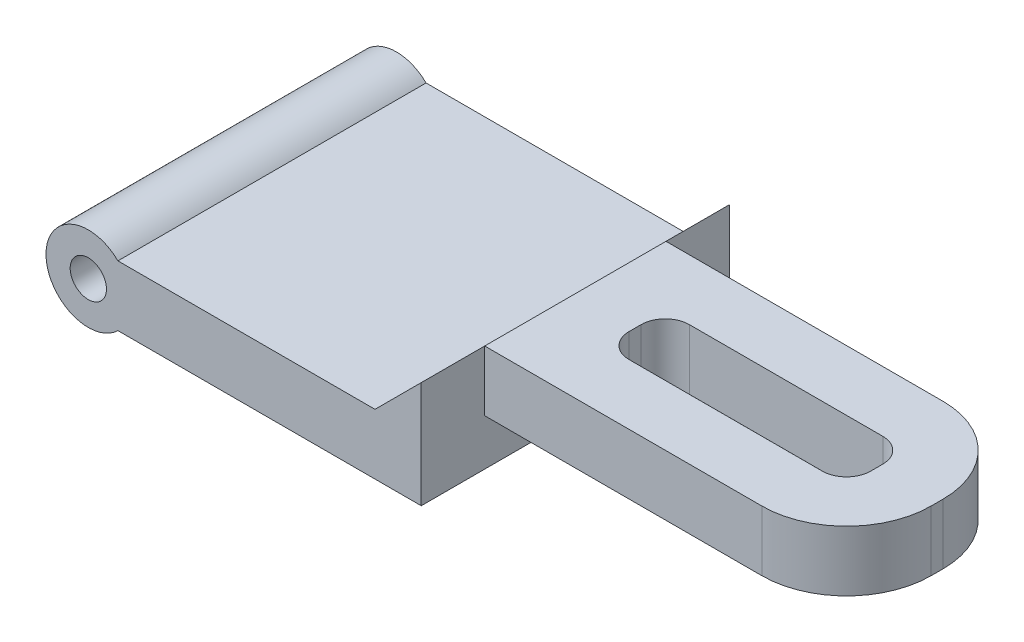
ISO-10303-21;
HEADER;
FILE_DESCRIPTION(('STEP AP214'),'2;1');
FILE_NAME('part.step','',(''),(''),'','','');
FILE_SCHEMA(('AUTOMOTIVE_DESIGN { 1 0 10303 214 1 1 1 1 }'));
ENDSEC;
DATA;
#1=APPLICATION_CONTEXT('core data for automotive mechanical design processes');
#2=APPLICATION_PROTOCOL_DEFINITION('international standard','automotive_design',2000,#1);
#3=PRODUCT_CONTEXT('',#1,'mechanical');
#4=PRODUCT('Part','Part','',(#3));
#5=PRODUCT_RELATED_PRODUCT_CATEGORY('part','',(#4));
#6=PRODUCT_DEFINITION_FORMATION('','',#4);
#7=PRODUCT_DEFINITION_CONTEXT('part definition',#1,'design');
#8=PRODUCT_DEFINITION('design','',#6,#7);
#9=PRODUCT_DEFINITION_SHAPE('','',#8);
#10=(LENGTH_UNIT() NAMED_UNIT(*) SI_UNIT(.MILLI.,.METRE.));
#11=(NAMED_UNIT(*) PLANE_ANGLE_UNIT() SI_UNIT($,.RADIAN.));
#12=(NAMED_UNIT(*) SI_UNIT($,.STERADIAN.) SOLID_ANGLE_UNIT());
#13=UNCERTAINTY_MEASURE_WITH_UNIT(LENGTH_MEASURE(1.E-05),#10,'distance_accuracy_value','');
#14=(GEOMETRIC_REPRESENTATION_CONTEXT(3) GLOBAL_UNCERTAINTY_ASSIGNED_CONTEXT((#13)) GLOBAL_UNIT_ASSIGNED_CONTEXT((#10,
#11,#12)) REPRESENTATION_CONTEXT('',''));
#15=CARTESIAN_POINT('',(0.,0.,0.));
#16=DIRECTION('',(0.,0.,1.));
#17=DIRECTION('',(1.,0.,0.));
#18=AXIS2_PLACEMENT_3D('',#15,#16,#17);
#19=CARTESIAN_POINT('',(0.,5.,0.));
#20=DIRECTION('',(0.,0.,-1.));
#21=DIRECTION('',(-1.,0.,0.));
#22=AXIS2_PLACEMENT_3D('',#19,#20,#21);
#23=PLANE('',#22);
#24=CARTESIAN_POINT('',(2.44948974278318,2.5,0.));
#25=DIRECTION('',(0.,0.,1.));
#26=DIRECTION('',(1.,0.,0.));
#27=AXIS2_PLACEMENT_3D('',#24,#25,#26);
#28=CIRCLE('',#27,1.5);
#29=CARTESIAN_POINT('',(3.94948974278318,2.5,0.));
#30=VERTEX_POINT('',#29);
#31=EDGE_CURVE('E246',#30,#30,#28,.T.);
#32=ORIENTED_EDGE('',*,*,#31,.F.);
#33=EDGE_LOOP('',(#32));
#34=FACE_BOUND('',#33,.T.);
#35=DIRECTION('',(0.,-1.,0.));
#36=VECTOR('',#35,1.);
#37=CARTESIAN_POINT('',(30.,5.,0.));
#38=LINE('',#37,#36);
#39=CARTESIAN_POINT('',(30.,8.82653248481806,0.));
#40=VERTEX_POINT('',#39);
#41=CARTESIAN_POINT('',(30.,0.,0.));
#42=VERTEX_POINT('',#41);
#43=EDGE_CURVE('E44',#40,#42,#38,.T.);
#44=ORIENTED_EDGE('',*,*,#43,.F.);
#45=DIRECTION('',(-0.707106781186547,-0.707106781186548,0.));
#46=VECTOR('',#45,1.);
#47=CARTESIAN_POINT('',(26.173467515182,5.,0.));
#48=LINE('',#47,#46);
#49=CARTESIAN_POINT('',(26.173467515182,5.,0.));
#50=VERTEX_POINT('',#49);
#51=EDGE_CURVE('E204',#40,#50,#48,.T.);
#52=ORIENTED_EDGE('',*,*,#51,.T.);
#53=DIRECTION('',(1.,0.,0.));
#54=VECTOR('',#53,1.);
#55=CARTESIAN_POINT('',(0.,5.,0.));
#56=LINE('',#55,#54);
#57=CARTESIAN_POINT('',(4.89897948556636,5.,0.));
#58=VERTEX_POINT('',#57);
#59=EDGE_CURVE('E210',#58,#50,#56,.T.);
#60=ORIENTED_EDGE('',*,*,#59,.F.);
#61=CARTESIAN_POINT('',(2.44948974278318,2.5,0.));
#62=DIRECTION('',(0.,0.,1.));
#63=DIRECTION('',(1.,0.,0.));
#64=AXIS2_PLACEMENT_3D('',#61,#62,#63);
#65=CIRCLE('',#64,3.5);
#66=CARTESIAN_POINT('',(4.89897948556636,0.,0.));
#67=VERTEX_POINT('',#66);
#68=EDGE_CURVE('E237',#58,#67,#65,.T.);
#69=ORIENTED_EDGE('',*,*,#68,.T.);
#70=DIRECTION('',(1.,0.,0.));
#71=VECTOR('',#70,1.);
#72=CARTESIAN_POINT('',(0.,0.,0.));
#73=LINE('',#72,#71);
#74=EDGE_CURVE('E211',#67,#42,#73,.T.);
#75=ORIENTED_EDGE('',*,*,#74,.T.);
#76=EDGE_LOOP('',(#44,#52,#60,#69,#75));
#77=FACE_BOUND('',#76,.T.);
#78=ADVANCED_FACE('F35',(#34,#77),#23,.F.);
#79=CARTESIAN_POINT('',(30.,5.,0.));
#80=DIRECTION('',(-1.,0.,0.));
#81=DIRECTION('',(0.,0.,1.));
#82=AXIS2_PLACEMENT_3D('',#79,#80,#81);
#83=PLANE('',#82);
#84=DIRECTION('',(0.,-1.,0.));
#85=VECTOR('',#84,1.);
#86=CARTESIAN_POINT('',(30.,5.,-25.5));
#87=LINE('',#86,#85);
#88=CARTESIAN_POINT('',(30.,8.82653248481806,-25.5));
#89=VERTEX_POINT('',#88);
#90=CARTESIAN_POINT('',(30.,0.,-25.5));
#91=VERTEX_POINT('',#90);
#92=EDGE_CURVE('E213',#89,#91,#87,.T.);
#93=ORIENTED_EDGE('',*,*,#92,.F.);
#94=DIRECTION('',(0.,0.,1.));
#95=VECTOR('',#94,1.);
#96=CARTESIAN_POINT('',(30.,8.82653248481806,-25.5));
#97=LINE('',#96,#95);
#98=CARTESIAN_POINT('',(30.,8.82653248481806,-20.25));
#99=VERTEX_POINT('',#98);
#100=EDGE_CURVE('E201',#89,#99,#97,.T.);
#101=ORIENTED_EDGE('',*,*,#100,.T.);
#102=DIRECTION('',(0.,-1.,0.));
#103=VECTOR('',#102,1.);
#104=CARTESIAN_POINT('',(30.,15.8298260225235,-20.25));
#105=LINE('',#104,#103);
#106=CARTESIAN_POINT('',(30.,3.82982602252354,-20.25));
#107=VERTEX_POINT('',#106);
#108=EDGE_CURVE('E195',#99,#107,#105,.T.);
#109=ORIENTED_EDGE('',*,*,#108,.T.);
#110=DIRECTION('',(0.,0.,1.));
#111=VECTOR('',#110,1.);
#112=CARTESIAN_POINT('',(30.,3.82982602252354,-25.5));
#113=LINE('',#112,#111);
#114=CARTESIAN_POINT('',(30.,3.82982602252354,-5.25));
#115=VERTEX_POINT('',#114);
#116=EDGE_CURVE('E188',#107,#115,#113,.T.);
#117=ORIENTED_EDGE('',*,*,#116,.T.);
#118=DIRECTION('',(0.,-1.,0.));
#119=VECTOR('',#118,1.);
#120=CARTESIAN_POINT('',(30.,15.8298260225235,-5.25));
#121=LINE('',#120,#119);
#122=CARTESIAN_POINT('',(30.,8.82653248481806,-5.25));
#123=VERTEX_POINT('',#122);
#124=EDGE_CURVE('E168',#123,#115,#121,.T.);
#125=ORIENTED_EDGE('',*,*,#124,.F.);
#126=DIRECTION('',(0.,0.,1.));
#127=VECTOR('',#126,1.);
#128=CARTESIAN_POINT('',(30.,8.82653248481806,-25.5));
#129=LINE('',#128,#127);
#130=EDGE_CURVE('E260',#123,#40,#129,.T.);
#131=ORIENTED_EDGE('',*,*,#130,.T.);
#132=ORIENTED_EDGE('',*,*,#43,.T.);
#133=DIRECTION('',(0.,0.,-1.));
#134=VECTOR('',#133,1.);
#135=CARTESIAN_POINT('',(30.,0.,0.));
#136=LINE('',#135,#134);
#137=EDGE_CURVE('E216',#42,#91,#136,.T.);
#138=ORIENTED_EDGE('',*,*,#137,.T.);
#139=EDGE_LOOP('',(#93,#101,#109,#117,#125,#131,#132,#138));
#140=FACE_BOUND('',#139,.T.);
#141=ADVANCED_FACE('F193',(#140),#83,.F.);
#142=CARTESIAN_POINT('',(0.,5.,-25.5));
#143=DIRECTION('',(0.,0.,-1.));
#144=DIRECTION('',(-1.,0.,0.));
#145=AXIS2_PLACEMENT_3D('',#142,#143,#144);
#146=PLANE('',#145);
#147=DIRECTION('',(-0.707106781186547,-0.707106781186548,0.));
#148=VECTOR('',#147,1.);
#149=CARTESIAN_POINT('',(26.173467515182,5.,-25.5));
#150=LINE('',#149,#148);
#151=CARTESIAN_POINT('',(26.173467515182,5.,-25.5));
#152=VERTEX_POINT('',#151);
#153=EDGE_CURVE('E198',#89,#152,#150,.T.);
#154=ORIENTED_EDGE('',*,*,#153,.F.);
#155=ORIENTED_EDGE('',*,*,#92,.T.);
#156=DIRECTION('',(1.,0.,0.));
#157=VECTOR('',#156,1.);
#158=CARTESIAN_POINT('',(0.,0.,-25.5));
#159=LINE('',#158,#157);
#160=CARTESIAN_POINT('',(4.89897948556636,0.,-25.5));
#161=VERTEX_POINT('',#160);
#162=EDGE_CURVE('E214',#161,#91,#159,.T.);
#163=ORIENTED_EDGE('',*,*,#162,.F.);
#164=CARTESIAN_POINT('',(2.44948974278318,2.5,-25.5));
#165=DIRECTION('',(0.,0.,1.));
#166=DIRECTION('',(1.,0.,0.));
#167=AXIS2_PLACEMENT_3D('',#164,#165,#166);
#168=CIRCLE('',#167,3.5);
#169=CARTESIAN_POINT('',(4.89897948556636,5.,-25.5));
#170=VERTEX_POINT('',#169);
#171=EDGE_CURVE('E239',#170,#161,#168,.T.);
#172=ORIENTED_EDGE('',*,*,#171,.F.);
#173=DIRECTION('',(1.,0.,0.));
#174=VECTOR('',#173,1.);
#175=CARTESIAN_POINT('',(0.,5.,-25.5));
#176=LINE('',#175,#174);
#177=EDGE_CURVE('E208',#170,#152,#176,.T.);
#178=ORIENTED_EDGE('',*,*,#177,.T.);
#179=EDGE_LOOP('',(#154,#155,#163,#172,#178));
#180=FACE_BOUND('',#179,.T.);
#181=CARTESIAN_POINT('',(2.44948974278318,2.5,-25.5));
#182=DIRECTION('',(0.,0.,-1.));
#183=DIRECTION('',(-1.,0.,0.));
#184=AXIS2_PLACEMENT_3D('',#181,#182,#183);
#185=CIRCLE('',#184,1.5);
#186=CARTESIAN_POINT('',(0.949489742783178,2.5,-25.5));
#187=VERTEX_POINT('',#186);
#188=EDGE_CURVE('E39',#187,#187,#185,.T.);
#189=ORIENTED_EDGE('',*,*,#188,.F.);
#190=EDGE_LOOP('',(#189));
#191=FACE_BOUND('',#190,.T.);
#192=ADVANCED_FACE('F37',(#180,#191),#146,.T.);
#193=CARTESIAN_POINT('',(0.,5.,0.));
#194=DIRECTION('',(0.,-1.,0.));
#195=DIRECTION('',(0.,0.,-1.));
#196=AXIS2_PLACEMENT_3D('',#193,#194,#195);
#197=PLANE('',#196);
#198=ORIENTED_EDGE('',*,*,#177,.F.);
#199=DIRECTION('',(0.,0.,1.));
#200=VECTOR('',#199,1.);
#201=CARTESIAN_POINT('',(4.89897948556636,5.,-25.5));
#202=LINE('',#201,#200);
#203=EDGE_CURVE('E240',#170,#58,#202,.T.);
#204=ORIENTED_EDGE('',*,*,#203,.T.);
#205=ORIENTED_EDGE('',*,*,#59,.T.);
#206=DIRECTION('',(0.,0.,1.));
#207=VECTOR('',#206,1.);
#208=CARTESIAN_POINT('',(26.173467515182,5.,-25.5));
#209=LINE('',#208,#207);
#210=EDGE_CURVE('E217',#152,#50,#209,.T.);
#211=ORIENTED_EDGE('',*,*,#210,.F.);
#212=EDGE_LOOP('',(#198,#204,#205,#211));
#213=FACE_BOUND('',#212,.T.);
#214=ADVANCED_FACE('F340',(#213),#197,.F.);
#215=CARTESIAN_POINT('',(0.,0.,0.));
#216=DIRECTION('',(0.,-1.,0.));
#217=DIRECTION('',(0.,0.,-1.));
#218=AXIS2_PLACEMENT_3D('',#215,#216,#217);
#219=PLANE('',#218);
#220=DIRECTION('',(0.,0.,1.));
#221=VECTOR('',#220,1.);
#222=CARTESIAN_POINT('',(4.89897948556636,0.,-25.5));
#223=LINE('',#222,#221);
#224=EDGE_CURVE('E11',#161,#67,#223,.T.);
#225=ORIENTED_EDGE('',*,*,#224,.F.);
#226=ORIENTED_EDGE('',*,*,#162,.T.);
#227=ORIENTED_EDGE('',*,*,#137,.F.);
#228=ORIENTED_EDGE('',*,*,#74,.F.);
#229=EDGE_LOOP('',(#225,#226,#227,#228));
#230=FACE_BOUND('',#229,.T.);
#231=ADVANCED_FACE('F234',(#230),#219,.T.);
#232=CARTESIAN_POINT('',(26.173467515182,5.,-25.5));
#233=DIRECTION('',(-0.707106781186548,0.707106781186547,0.));
#234=DIRECTION('',(-0.707106781186547,-0.707106781186548,0.));
#235=AXIS2_PLACEMENT_3D('',#232,#233,#234);
#236=PLANE('',#235);
#237=ORIENTED_EDGE('',*,*,#51,.F.);
#238=ORIENTED_EDGE('',*,*,#130,.F.);
#239=EDGE_CURVE('E197',#99,#123,#97,.T.);
#240=ORIENTED_EDGE('',*,*,#239,.F.);
#241=ORIENTED_EDGE('',*,*,#100,.F.);
#242=ORIENTED_EDGE('',*,*,#153,.T.);
#243=ORIENTED_EDGE('',*,*,#210,.T.);
#244=EDGE_LOOP('',(#237,#238,#240,#241,#242,#243));
#245=FACE_BOUND('',#244,.T.);
#246=ADVANCED_FACE('F270',(#245),#236,.T.);
#247=CARTESIAN_POINT('',(30.,8.82653248481806,-25.5));
#248=DIRECTION('',(0.,1.,0.));
#249=DIRECTION('',(-1.,0.,0.));
#250=AXIS2_PLACEMENT_3D('',#247,#248,#249);
#251=PLANE('',#250);
#252=DIRECTION('',(1.,0.,0.));
#253=VECTOR('',#252,1.);
#254=CARTESIAN_POINT('',(30.,8.82653248481806,-20.25));
#255=LINE('',#254,#253);
#256=CARTESIAN_POINT('',(52.9385656953439,8.82653248481806,-20.25));
#257=VERTEX_POINT('',#256);
#258=EDGE_CURVE('E258',#99,#257,#255,.T.);
#259=ORIENTED_EDGE('',*,*,#258,.F.);
#260=ORIENTED_EDGE('',*,*,#239,.T.);
#261=DIRECTION('',(-1.,0.,0.));
#262=VECTOR('',#261,1.);
#263=CARTESIAN_POINT('',(30.,8.82653248481806,-5.25));
#264=LINE('',#263,#262);
#265=CARTESIAN_POINT('',(52.9385656953439,8.82653248481806,-5.25));
#266=VERTEX_POINT('',#265);
#267=EDGE_CURVE('E175',#266,#123,#264,.T.);
#268=ORIENTED_EDGE('',*,*,#267,.F.);
#269=CARTESIAN_POINT('',(52.9385656953439,8.82653248481806,-12.25));
#270=DIRECTION('',(0.,1.,0.));
#271=DIRECTION('',(-1.,0.,0.));
#272=AXIS2_PLACEMENT_3D('',#269,#270,#271);
#273=CIRCLE('',#272,7.);
#274=CARTESIAN_POINT('',(59.9385656953439,8.82653248481806,-12.25));
#275=VERTEX_POINT('',#274);
#276=EDGE_CURVE('E272',#275,#266,#273,.F.);
#277=ORIENTED_EDGE('',*,*,#276,.F.);
#278=DIRECTION('',(0.,0.,1.));
#279=VECTOR('',#278,1.);
#280=CARTESIAN_POINT('',(59.9385656953439,8.82653248481806,-25.5));
#281=LINE('',#280,#279);
#282=CARTESIAN_POINT('',(59.9385656953439,8.82653248481806,-13.25));
#283=VERTEX_POINT('',#282);
#284=EDGE_CURVE('E277',#283,#275,#281,.T.);
#285=ORIENTED_EDGE('',*,*,#284,.F.);
#286=CARTESIAN_POINT('',(52.9385656953439,8.82653248481806,-13.25));
#287=DIRECTION('',(0.,1.,0.));
#288=DIRECTION('',(-1.,0.,0.));
#289=AXIS2_PLACEMENT_3D('',#286,#287,#288);
#290=CIRCLE('',#289,7.);
#291=EDGE_CURVE('E268',#257,#283,#290,.F.);
#292=ORIENTED_EDGE('',*,*,#291,.F.);
#293=EDGE_LOOP('',(#259,#260,#268,#277,#285,#292));
#294=FACE_BOUND('',#293,.T.);
#295=CARTESIAN_POINT('',(36.9385656953439,8.82653248481806,-13.25));
#296=DIRECTION('',(0.,1.,0.));
#297=DIRECTION('',(-1.,0.,0.));
#298=AXIS2_PLACEMENT_3D('',#295,#296,#297);
#299=CIRCLE('',#298,2.);
#300=CARTESIAN_POINT('',(36.9385656953439,8.82653248481806,-15.25));
#301=VERTEX_POINT('',#300);
#302=CARTESIAN_POINT('',(34.9385656953439,8.82653248481806,-13.25));
#303=VERTEX_POINT('',#302);
#304=EDGE_CURVE('E329',#301,#303,#299,.T.);
#305=ORIENTED_EDGE('',*,*,#304,.F.);
#306=DIRECTION('',(-1.,0.,0.));
#307=VECTOR('',#306,1.);
#308=CARTESIAN_POINT('',(30.,8.82653248481806,-15.25));
#309=LINE('',#308,#307);
#310=CARTESIAN_POINT('',(52.9385656953439,8.82653248481806,-15.25));
#311=VERTEX_POINT('',#310);
#312=EDGE_CURVE('E304',#311,#301,#309,.T.);
#313=ORIENTED_EDGE('',*,*,#312,.F.);
#314=CARTESIAN_POINT('',(52.9385656953439,8.82653248481806,-13.25));
#315=DIRECTION('',(0.,1.,0.));
#316=DIRECTION('',(-1.,0.,0.));
#317=AXIS2_PLACEMENT_3D('',#314,#315,#316);
#318=CIRCLE('',#317,2.);
#319=CARTESIAN_POINT('',(54.9385656953439,8.82653248481806,-13.25));
#320=VERTEX_POINT('',#319);
#321=EDGE_CURVE('E318',#320,#311,#318,.T.);
#322=ORIENTED_EDGE('',*,*,#321,.F.);
#323=DIRECTION('',(0.,0.,-1.));
#324=VECTOR('',#323,1.);
#325=CARTESIAN_POINT('',(54.9385656953439,8.82653248481806,-25.5));
#326=LINE('',#325,#324);
#327=CARTESIAN_POINT('',(54.9385656953439,8.82653248481806,-12.25));
#328=VERTEX_POINT('',#327);
#329=EDGE_CURVE('E320',#328,#320,#326,.T.);
#330=ORIENTED_EDGE('',*,*,#329,.F.);
#331=CARTESIAN_POINT('',(52.9385656953439,8.82653248481806,-12.25));
#332=DIRECTION('',(0.,1.,0.));
#333=DIRECTION('',(-1.,0.,0.));
#334=AXIS2_PLACEMENT_3D('',#331,#332,#333);
#335=CIRCLE('',#334,2.);
#336=CARTESIAN_POINT('',(52.9385656953439,8.82653248481806,-10.25));
#337=VERTEX_POINT('',#336);
#338=EDGE_CURVE('E322',#337,#328,#335,.T.);
#339=ORIENTED_EDGE('',*,*,#338,.F.);
#340=DIRECTION('',(1.,0.,0.));
#341=VECTOR('',#340,1.);
#342=CARTESIAN_POINT('',(30.,8.82653248481806,-10.25));
#343=LINE('',#342,#341);
#344=CARTESIAN_POINT('',(36.9385656953439,8.82653248481806,-10.25));
#345=VERTEX_POINT('',#344);
#346=EDGE_CURVE('E324',#345,#337,#343,.T.);
#347=ORIENTED_EDGE('',*,*,#346,.F.);
#348=CARTESIAN_POINT('',(36.9385656953439,8.82653248481806,-12.25));
#349=DIRECTION('',(0.,1.,0.));
#350=DIRECTION('',(-1.,0.,0.));
#351=AXIS2_PLACEMENT_3D('',#348,#349,#350);
#352=CIRCLE('',#351,2.);
#353=CARTESIAN_POINT('',(34.9385656953439,8.82653248481806,-12.25));
#354=VERTEX_POINT('',#353);
#355=EDGE_CURVE('E326',#354,#345,#352,.T.);
#356=ORIENTED_EDGE('',*,*,#355,.F.);
#357=DIRECTION('',(0.,0.,1.));
#358=VECTOR('',#357,1.);
#359=CARTESIAN_POINT('',(34.9385656953439,8.82653248481806,-25.5));
#360=LINE('',#359,#358);
#361=EDGE_CURVE('E328',#303,#354,#360,.T.);
#362=ORIENTED_EDGE('',*,*,#361,.F.);
#363=EDGE_LOOP('',(#305,#313,#322,#330,#339,#347,#356,#362));
#364=FACE_BOUND('',#363,.T.);
#365=ADVANCED_FACE('F265',(#294,#364),#251,.T.);
#366=CARTESIAN_POINT('',(60.,3.82982602252355,-25.5));
#367=DIRECTION('',(0.,-1.,0.));
#368=DIRECTION('',(1.,0.,0.));
#369=AXIS2_PLACEMENT_3D('',#366,#367,#368);
#370=PLANE('',#369);
#371=DIRECTION('',(-1.,0.,0.));
#372=VECTOR('',#371,1.);
#373=CARTESIAN_POINT('',(30.,3.82982602252354,-20.25));
#374=LINE('',#373,#372);
#375=CARTESIAN_POINT('',(52.9385656953439,3.82982602252354,-20.25));
#376=VERTEX_POINT('',#375);
#377=EDGE_CURVE('E181',#376,#107,#374,.T.);
#378=ORIENTED_EDGE('',*,*,#377,.F.);
#379=CARTESIAN_POINT('',(52.9385656953439,3.82982602252354,-13.25));
#380=DIRECTION('',(0.,1.,0.));
#381=DIRECTION('',(1.,0.,0.));
#382=AXIS2_PLACEMENT_3D('',#379,#380,#381);
#383=CIRCLE('',#382,7.);
#384=CARTESIAN_POINT('',(59.9385656953439,3.82982602252355,-13.25));
#385=VERTEX_POINT('',#384);
#386=EDGE_CURVE('E583',#385,#376,#383,.T.);
#387=ORIENTED_EDGE('',*,*,#386,.F.);
#388=DIRECTION('',(0.,0.,-1.));
#389=VECTOR('',#388,1.);
#390=CARTESIAN_POINT('',(59.9385656953439,3.82982602252355,-13.25));
#391=LINE('',#390,#389);
#392=CARTESIAN_POINT('',(59.9385656953439,3.82982602252355,-12.25));
#393=VERTEX_POINT('',#392);
#394=EDGE_CURVE('E574',#393,#385,#391,.T.);
#395=ORIENTED_EDGE('',*,*,#394,.F.);
#396=CARTESIAN_POINT('',(52.9385656953439,3.82982602252354,-12.25));
#397=DIRECTION('',(0.,1.,0.));
#398=DIRECTION('',(1.,0.,0.));
#399=AXIS2_PLACEMENT_3D('',#396,#397,#398);
#400=CIRCLE('',#399,7.);
#401=CARTESIAN_POINT('',(52.9385656953439,3.82982602252354,-5.25));
#402=VERTEX_POINT('',#401);
#403=EDGE_CURVE('E191',#402,#393,#400,.T.);
#404=ORIENTED_EDGE('',*,*,#403,.F.);
#405=DIRECTION('',(1.,0.,0.));
#406=VECTOR('',#405,1.);
#407=CARTESIAN_POINT('',(52.9385656953439,3.82982602252354,-5.25));
#408=LINE('',#407,#406);
#409=EDGE_CURVE('E172',#115,#402,#408,.T.);
#410=ORIENTED_EDGE('',*,*,#409,.F.);
#411=ORIENTED_EDGE('',*,*,#116,.F.);
#412=EDGE_LOOP('',(#378,#387,#395,#404,#410,#411));
#413=FACE_BOUND('',#412,.T.);
#414=CARTESIAN_POINT('',(36.9385656953439,3.82982602252354,-13.25));
#415=DIRECTION('',(0.,-1.,0.));
#416=DIRECTION('',(1.,0.,0.));
#417=AXIS2_PLACEMENT_3D('',#414,#415,#416);
#418=CIRCLE('',#417,2.);
#419=CARTESIAN_POINT('',(34.9385656953439,3.82982602252354,-13.25));
#420=VERTEX_POINT('',#419);
#421=CARTESIAN_POINT('',(36.9385656953439,3.82982602252354,-15.25));
#422=VERTEX_POINT('',#421);
#423=EDGE_CURVE('E59',#420,#422,#418,.T.);
#424=ORIENTED_EDGE('',*,*,#423,.F.);
#425=DIRECTION('',(0.,0.,-1.));
#426=VECTOR('',#425,1.);
#427=CARTESIAN_POINT('',(34.9385656953439,3.82982602252354,-12.25));
#428=LINE('',#427,#426);
#429=CARTESIAN_POINT('',(34.9385656953439,3.82982602252354,-12.25));
#430=VERTEX_POINT('',#429);
#431=EDGE_CURVE('E298',#430,#420,#428,.T.);
#432=ORIENTED_EDGE('',*,*,#431,.F.);
#433=CARTESIAN_POINT('',(36.9385656953439,3.82982602252354,-12.25));
#434=DIRECTION('',(0.,-1.,0.));
#435=DIRECTION('',(-1.,0.,0.));
#436=AXIS2_PLACEMENT_3D('',#433,#434,#435);
#437=CIRCLE('',#436,2.);
#438=CARTESIAN_POINT('',(36.9385656953439,3.82982602252354,-10.25));
#439=VERTEX_POINT('',#438);
#440=EDGE_CURVE('E295',#439,#430,#437,.T.);
#441=ORIENTED_EDGE('',*,*,#440,.F.);
#442=DIRECTION('',(-1.,0.,0.));
#443=VECTOR('',#442,1.);
#444=CARTESIAN_POINT('',(52.9385656953439,3.82982602252354,-10.25));
#445=LINE('',#444,#443);
#446=CARTESIAN_POINT('',(52.9385656953439,3.82982602252354,-10.25));
#447=VERTEX_POINT('',#446);
#448=EDGE_CURVE('E292',#447,#439,#445,.T.);
#449=ORIENTED_EDGE('',*,*,#448,.F.);
#450=CARTESIAN_POINT('',(52.9385656953439,3.82982602252354,-12.25));
#451=DIRECTION('',(0.,-1.,0.));
#452=DIRECTION('',(1.,0.,0.));
#453=AXIS2_PLACEMENT_3D('',#450,#451,#452);
#454=CIRCLE('',#453,2.);
#455=CARTESIAN_POINT('',(54.9385656953439,3.82982602252354,-12.25));
#456=VERTEX_POINT('',#455);
#457=EDGE_CURVE('E289',#456,#447,#454,.T.);
#458=ORIENTED_EDGE('',*,*,#457,.F.);
#459=DIRECTION('',(0.,0.,1.));
#460=VECTOR('',#459,1.);
#461=CARTESIAN_POINT('',(54.9385656953439,3.82982602252354,-12.25));
#462=LINE('',#461,#460);
#463=CARTESIAN_POINT('',(54.9385656953439,3.82982602252354,-13.25));
#464=VERTEX_POINT('',#463);
#465=EDGE_CURVE('E286',#464,#456,#462,.T.);
#466=ORIENTED_EDGE('',*,*,#465,.F.);
#467=CARTESIAN_POINT('',(52.9385656953439,3.82982602252354,-13.25));
#468=DIRECTION('',(0.,-1.,0.));
#469=DIRECTION('',(1.,0.,0.));
#470=AXIS2_PLACEMENT_3D('',#467,#468,#469);
#471=CIRCLE('',#470,2.);
#472=CARTESIAN_POINT('',(52.9385656953439,3.82982602252354,-15.25));
#473=VERTEX_POINT('',#472);
#474=EDGE_CURVE('E283',#473,#464,#471,.T.);
#475=ORIENTED_EDGE('',*,*,#474,.F.);
#476=DIRECTION('',(1.,0.,0.));
#477=VECTOR('',#476,1.);
#478=CARTESIAN_POINT('',(52.9385656953439,3.82982602252354,-15.25));
#479=LINE('',#478,#477);
#480=EDGE_CURVE('E281',#422,#473,#479,.T.);
#481=ORIENTED_EDGE('',*,*,#480,.F.);
#482=EDGE_LOOP('',(#424,#432,#441,#449,#458,#466,#475,#481));
#483=FACE_BOUND('',#482,.T.);
#484=ADVANCED_FACE('F186',(#413,#483),#370,.T.);
#485=CARTESIAN_POINT('',(2.44948974278318,2.5,-25.5));
#486=DIRECTION('',(0.,0.,1.));
#487=DIRECTION('',(1.,0.,0.));
#488=AXIS2_PLACEMENT_3D('',#485,#486,#487);
#489=CYLINDRICAL_SURFACE('',#488,3.5);
#490=ORIENTED_EDGE('',*,*,#203,.F.);
#491=ORIENTED_EDGE('',*,*,#171,.T.);
#492=ORIENTED_EDGE('',*,*,#224,.T.);
#493=ORIENTED_EDGE('',*,*,#68,.F.);
#494=EDGE_LOOP('',(#490,#491,#492,#493));
#495=FACE_BOUND('',#494,.T.);
#496=ADVANCED_FACE('F236',(#495),#489,.T.);
#497=CARTESIAN_POINT('',(2.44948974278318,2.5,-31.));
#498=DIRECTION('',(0.,0.,1.));
#499=DIRECTION('',(1.,0.,0.));
#500=AXIS2_PLACEMENT_3D('',#497,#498,#499);
#501=CYLINDRICAL_SURFACE('',#500,1.5);
#502=ORIENTED_EDGE('',*,*,#188,.T.);
#503=EDGE_LOOP('',(#502));
#504=FACE_BOUND('',#503,.T.);
#505=ORIENTED_EDGE('',*,*,#31,.T.);
#506=EDGE_LOOP('',(#505));
#507=FACE_BOUND('',#506,.T.);
#508=ADVANCED_FACE('F338',(#504,#507),#501,.F.);
#509=CARTESIAN_POINT('',(36.9385656953439,34.8298260225235,-13.25));
#510=DIRECTION('',(0.,-1.,0.));
#511=DIRECTION('',(1.,0.,0.));
#512=AXIS2_PLACEMENT_3D('',#509,#510,#511);
#513=CYLINDRICAL_SURFACE('',#512,2.);
#514=ORIENTED_EDGE('',*,*,#304,.T.);
#515=DIRECTION('',(0.,-1.,0.));
#516=VECTOR('',#515,1.);
#517=CARTESIAN_POINT('',(34.9385656953439,34.8298260225235,-13.25));
#518=LINE('',#517,#516);
#519=EDGE_CURVE('E302',#303,#420,#518,.T.);
#520=ORIENTED_EDGE('',*,*,#519,.T.);
#521=ORIENTED_EDGE('',*,*,#423,.T.);
#522=DIRECTION('',(0.,-1.,0.));
#523=VECTOR('',#522,1.);
#524=CARTESIAN_POINT('',(36.9385656953439,34.8298260225235,-15.25));
#525=LINE('',#524,#523);
#526=EDGE_CURVE('E301',#301,#422,#525,.T.);
#527=ORIENTED_EDGE('',*,*,#526,.F.);
#528=EDGE_LOOP('',(#514,#520,#521,#527));
#529=FACE_BOUND('',#528,.T.);
#530=ADVANCED_FACE('F366',(#529),#513,.F.);
#531=CARTESIAN_POINT('',(34.9385656953439,34.8298260225235,-12.25));
#532=DIRECTION('',(-1.,0.,0.));
#533=DIRECTION('',(0.,-1.,0.));
#534=AXIS2_PLACEMENT_3D('',#531,#532,#533);
#535=PLANE('',#534);
#536=ORIENTED_EDGE('',*,*,#361,.T.);
#537=DIRECTION('',(0.,-1.,0.));
#538=VECTOR('',#537,1.);
#539=CARTESIAN_POINT('',(34.9385656953439,34.8298260225235,-12.25));
#540=LINE('',#539,#538);
#541=EDGE_CURVE('E305',#354,#430,#540,.T.);
#542=ORIENTED_EDGE('',*,*,#541,.T.);
#543=ORIENTED_EDGE('',*,*,#431,.T.);
#544=ORIENTED_EDGE('',*,*,#519,.F.);
#545=EDGE_LOOP('',(#536,#542,#543,#544));
#546=FACE_BOUND('',#545,.T.);
#547=ADVANCED_FACE('F369',(#546),#535,.F.);
#548=CARTESIAN_POINT('',(36.9385656953439,34.8298260225235,-12.25));
#549=DIRECTION('',(0.,-1.,0.));
#550=DIRECTION('',(1.,0.,0.));
#551=AXIS2_PLACEMENT_3D('',#548,#549,#550);
#552=CYLINDRICAL_SURFACE('',#551,2.);
#553=ORIENTED_EDGE('',*,*,#355,.T.);
#554=DIRECTION('',(0.,-1.,0.));
#555=VECTOR('',#554,1.);
#556=CARTESIAN_POINT('',(36.9385656953439,34.8298260225235,-10.25));
#557=LINE('',#556,#555);
#558=EDGE_CURVE('E307',#345,#439,#557,.T.);
#559=ORIENTED_EDGE('',*,*,#558,.T.);
#560=ORIENTED_EDGE('',*,*,#440,.T.);
#561=ORIENTED_EDGE('',*,*,#541,.F.);
#562=EDGE_LOOP('',(#553,#559,#560,#561));
#563=FACE_BOUND('',#562,.T.);
#564=ADVANCED_FACE('F388',(#563),#552,.F.);
#565=CARTESIAN_POINT('',(52.9385656953439,34.8298260225235,-10.25));
#566=DIRECTION('',(0.,0.,1.));
#567=DIRECTION('',(1.,0.,0.));
#568=AXIS2_PLACEMENT_3D('',#565,#566,#567);
#569=PLANE('',#568);
#570=ORIENTED_EDGE('',*,*,#346,.T.);
#571=DIRECTION('',(0.,-1.,0.));
#572=VECTOR('',#571,1.);
#573=CARTESIAN_POINT('',(52.9385656953439,34.8298260225235,-10.25));
#574=LINE('',#573,#572);
#575=EDGE_CURVE('E309',#337,#447,#574,.T.);
#576=ORIENTED_EDGE('',*,*,#575,.T.);
#577=ORIENTED_EDGE('',*,*,#448,.T.);
#578=ORIENTED_EDGE('',*,*,#558,.F.);
#579=EDGE_LOOP('',(#570,#576,#577,#578));
#580=FACE_BOUND('',#579,.T.);
#581=ADVANCED_FACE('F384',(#580),#569,.F.);
#582=CARTESIAN_POINT('',(52.9385656953439,34.8298260225235,-12.25));
#583=DIRECTION('',(0.,-1.,0.));
#584=DIRECTION('',(1.,0.,0.));
#585=AXIS2_PLACEMENT_3D('',#582,#583,#584);
#586=CYLINDRICAL_SURFACE('',#585,2.);
#587=ORIENTED_EDGE('',*,*,#338,.T.);
#588=DIRECTION('',(0.,-1.,0.));
#589=VECTOR('',#588,1.);
#590=CARTESIAN_POINT('',(54.9385656953439,34.8298260225236,-12.25));
#591=LINE('',#590,#589);
#592=EDGE_CURVE('E311',#328,#456,#591,.T.);
#593=ORIENTED_EDGE('',*,*,#592,.T.);
#594=ORIENTED_EDGE('',*,*,#457,.T.);
#595=ORIENTED_EDGE('',*,*,#575,.F.);
#596=EDGE_LOOP('',(#587,#593,#594,#595));
#597=FACE_BOUND('',#596,.T.);
#598=ADVANCED_FACE('F380',(#597),#586,.F.);
#599=CARTESIAN_POINT('',(54.9385656953439,34.8298260225236,-12.25));
#600=DIRECTION('',(1.,0.,0.));
#601=DIRECTION('',(0.,1.,0.));
#602=AXIS2_PLACEMENT_3D('',#599,#600,#601);
#603=PLANE('',#602);
#604=ORIENTED_EDGE('',*,*,#329,.T.);
#605=DIRECTION('',(0.,-1.,0.));
#606=VECTOR('',#605,1.);
#607=CARTESIAN_POINT('',(54.9385656953439,34.8298260225236,-13.25));
#608=LINE('',#607,#606);
#609=EDGE_CURVE('E313',#320,#464,#608,.T.);
#610=ORIENTED_EDGE('',*,*,#609,.T.);
#611=ORIENTED_EDGE('',*,*,#465,.T.);
#612=ORIENTED_EDGE('',*,*,#592,.F.);
#613=EDGE_LOOP('',(#604,#610,#611,#612));
#614=FACE_BOUND('',#613,.T.);
#615=ADVANCED_FACE('F376',(#614),#603,.F.);
#616=CARTESIAN_POINT('',(52.9385656953439,34.8298260225235,-13.25));
#617=DIRECTION('',(0.,-1.,0.));
#618=DIRECTION('',(1.,0.,0.));
#619=AXIS2_PLACEMENT_3D('',#616,#617,#618);
#620=CYLINDRICAL_SURFACE('',#619,2.);
#621=ORIENTED_EDGE('',*,*,#321,.T.);
#622=DIRECTION('',(0.,-1.,0.));
#623=VECTOR('',#622,1.);
#624=CARTESIAN_POINT('',(52.9385656953439,34.8298260225235,-15.25));
#625=LINE('',#624,#623);
#626=EDGE_CURVE('E51',#311,#473,#625,.T.);
#627=ORIENTED_EDGE('',*,*,#626,.T.);
#628=ORIENTED_EDGE('',*,*,#474,.T.);
#629=ORIENTED_EDGE('',*,*,#609,.F.);
#630=EDGE_LOOP('',(#621,#627,#628,#629));
#631=FACE_BOUND('',#630,.T.);
#632=ADVANCED_FACE('F373',(#631),#620,.F.);
#633=CARTESIAN_POINT('',(52.9385656953439,34.8298260225235,-15.25));
#634=DIRECTION('',(0.,0.,-1.));
#635=DIRECTION('',(-1.,0.,0.));
#636=AXIS2_PLACEMENT_3D('',#633,#634,#635);
#637=PLANE('',#636);
#638=ORIENTED_EDGE('',*,*,#312,.T.);
#639=ORIENTED_EDGE('',*,*,#526,.T.);
#640=ORIENTED_EDGE('',*,*,#480,.T.);
#641=ORIENTED_EDGE('',*,*,#626,.F.);
#642=EDGE_LOOP('',(#638,#639,#640,#641));
#643=FACE_BOUND('',#642,.T.);
#644=ADVANCED_FACE('F370',(#643),#637,.F.);
#645=CARTESIAN_POINT('',(30.,15.8298260225235,-20.25));
#646=DIRECTION('',(0.,0.,1.));
#647=DIRECTION('',(1.,0.,0.));
#648=AXIS2_PLACEMENT_3D('',#645,#646,#647);
#649=PLANE('',#648);
#650=ORIENTED_EDGE('',*,*,#258,.T.);
#651=DIRECTION('',(0.,-1.,0.));
#652=VECTOR('',#651,1.);
#653=CARTESIAN_POINT('',(52.9385656953439,15.8298260225235,-20.25));
#654=LINE('',#653,#652);
#655=EDGE_CURVE('E261',#257,#376,#654,.T.);
#656=ORIENTED_EDGE('',*,*,#655,.T.);
#657=ORIENTED_EDGE('',*,*,#377,.T.);
#658=ORIENTED_EDGE('',*,*,#108,.F.);
#659=EDGE_LOOP('',(#650,#656,#657,#658));
#660=FACE_BOUND('',#659,.T.);
#661=ADVANCED_FACE('F257',(#660),#649,.F.);
#662=CARTESIAN_POINT('',(52.9385656953439,15.8298260225235,-13.25));
#663=DIRECTION('',(0.,-1.,0.));
#664=DIRECTION('',(1.,0.,0.));
#665=AXIS2_PLACEMENT_3D('',#662,#663,#664);
#666=CYLINDRICAL_SURFACE('',#665,7.);
#667=ORIENTED_EDGE('',*,*,#291,.T.);
#668=DIRECTION('',(0.,-1.,0.));
#669=VECTOR('',#668,1.);
#670=CARTESIAN_POINT('',(59.9385656953439,15.8298260225235,-13.25));
#671=LINE('',#670,#669);
#672=EDGE_CURVE('E571',#283,#385,#671,.T.);
#673=ORIENTED_EDGE('',*,*,#672,.T.);
#674=ORIENTED_EDGE('',*,*,#386,.T.);
#675=ORIENTED_EDGE('',*,*,#655,.F.);
#676=EDGE_LOOP('',(#667,#673,#674,#675));
#677=FACE_BOUND('',#676,.T.);
#678=ADVANCED_FACE('F405',(#677),#666,.T.);
#679=CARTESIAN_POINT('',(59.9385656953439,15.8298260225235,-13.25));
#680=DIRECTION('',(-1.,0.,0.));
#681=DIRECTION('',(0.,-1.,0.));
#682=AXIS2_PLACEMENT_3D('',#679,#680,#681);
#683=PLANE('',#682);
#684=ORIENTED_EDGE('',*,*,#284,.T.);
#685=DIRECTION('',(0.,-1.,0.));
#686=VECTOR('',#685,1.);
#687=CARTESIAN_POINT('',(59.9385656953439,15.8298260225235,-12.25));
#688=LINE('',#687,#686);
#689=EDGE_CURVE('E576',#275,#393,#688,.T.);
#690=ORIENTED_EDGE('',*,*,#689,.T.);
#691=ORIENTED_EDGE('',*,*,#394,.T.);
#692=ORIENTED_EDGE('',*,*,#672,.F.);
#693=EDGE_LOOP('',(#684,#690,#691,#692));
#694=FACE_BOUND('',#693,.T.);
#695=ADVANCED_FACE('F401',(#694),#683,.F.);
#696=CARTESIAN_POINT('',(52.9385656953439,15.8298260225235,-12.25));
#697=DIRECTION('',(0.,-1.,0.));
#698=DIRECTION('',(1.,0.,0.));
#699=AXIS2_PLACEMENT_3D('',#696,#697,#698);
#700=CYLINDRICAL_SURFACE('',#699,7.);
#701=ORIENTED_EDGE('',*,*,#276,.T.);
#702=DIRECTION('',(0.,-1.,0.));
#703=VECTOR('',#702,1.);
#704=CARTESIAN_POINT('',(52.9385656953439,15.8298260225235,-5.25));
#705=LINE('',#704,#703);
#706=EDGE_CURVE('E180',#266,#402,#705,.T.);
#707=ORIENTED_EDGE('',*,*,#706,.T.);
#708=ORIENTED_EDGE('',*,*,#403,.T.);
#709=ORIENTED_EDGE('',*,*,#689,.F.);
#710=EDGE_LOOP('',(#701,#707,#708,#709));
#711=FACE_BOUND('',#710,.T.);
#712=ADVANCED_FACE('F398',(#711),#700,.T.);
#713=CARTESIAN_POINT('',(52.9385656953439,15.8298260225235,-5.25));
#714=DIRECTION('',(0.,0.,-1.));
#715=DIRECTION('',(-1.,0.,0.));
#716=AXIS2_PLACEMENT_3D('',#713,#714,#715);
#717=PLANE('',#716);
#718=ORIENTED_EDGE('',*,*,#267,.T.);
#719=ORIENTED_EDGE('',*,*,#124,.T.);
#720=ORIENTED_EDGE('',*,*,#409,.T.);
#721=ORIENTED_EDGE('',*,*,#706,.F.);
#722=EDGE_LOOP('',(#718,#719,#720,#721));
#723=FACE_BOUND('',#722,.T.);
#724=ADVANCED_FACE('F170',(#723),#717,.F.);
#725=CLOSED_SHELL('',(#78,#141,#192,#214,#231,#246,#365,#484,#496,#508,#530,#547,#564,#581,#598,
#615,#632,#644,#661,#678,#695,#712,#724));
#726=MANIFOLD_SOLID_BREP('B2',#725);
#727=ADVANCED_BREP_SHAPE_REPRESENTATION('',(#18,#726),#14);
#728=SHAPE_DEFINITION_REPRESENTATION(#9,#727);
ENDSEC;
END-ISO-10303-21;
